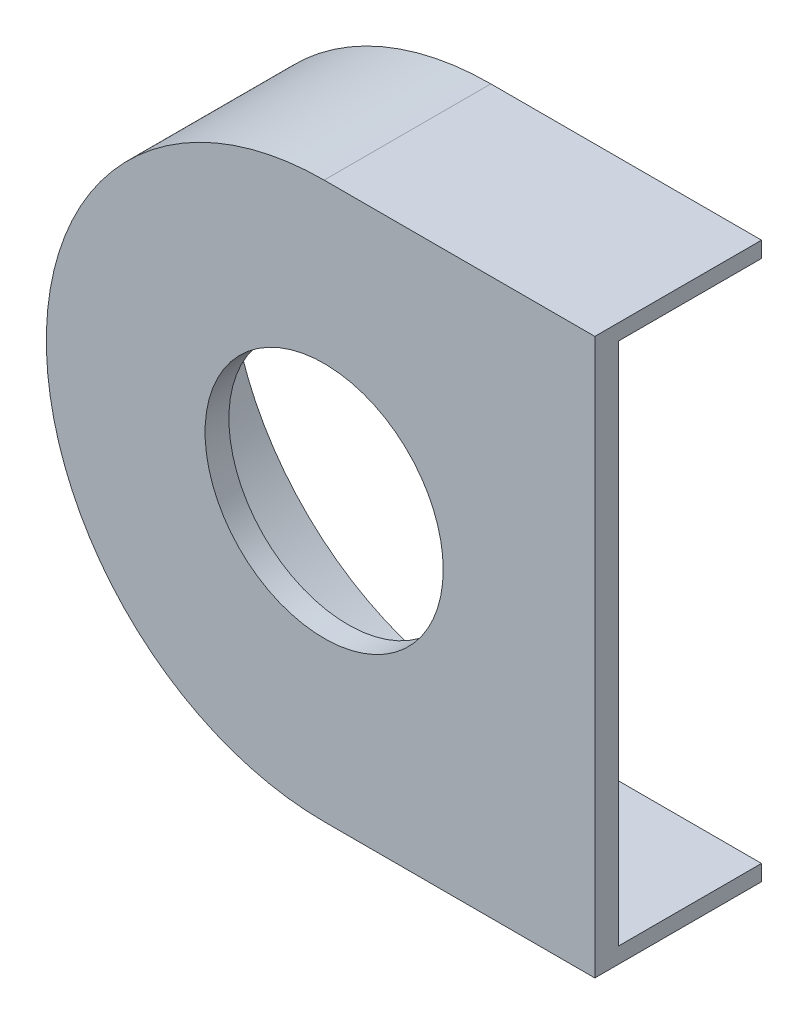
ISO-10303-21;
HEADER;
FILE_DESCRIPTION(('STEP AP214'),'2;1');
FILE_NAME('part.step','',(''),(''),'','','');
FILE_SCHEMA(('AUTOMOTIVE_DESIGN { 1 0 10303 214 1 1 1 1 }'));
ENDSEC;
DATA;
#1=APPLICATION_CONTEXT('core data for automotive mechanical design processes');
#2=APPLICATION_PROTOCOL_DEFINITION('international standard','automotive_design',2000,#1);
#3=PRODUCT_CONTEXT('',#1,'mechanical');
#4=PRODUCT('Part','Part','',(#3));
#5=PRODUCT_RELATED_PRODUCT_CATEGORY('part','',(#4));
#6=PRODUCT_DEFINITION_FORMATION('','',#4);
#7=PRODUCT_DEFINITION_CONTEXT('part definition',#1,'design');
#8=PRODUCT_DEFINITION('design','',#6,#7);
#9=PRODUCT_DEFINITION_SHAPE('','',#8);
#10=(LENGTH_UNIT() NAMED_UNIT(*) SI_UNIT(.MILLI.,.METRE.));
#11=(NAMED_UNIT(*) PLANE_ANGLE_UNIT() SI_UNIT($,.RADIAN.));
#12=(NAMED_UNIT(*) SI_UNIT($,.STERADIAN.) SOLID_ANGLE_UNIT());
#13=UNCERTAINTY_MEASURE_WITH_UNIT(LENGTH_MEASURE(1.E-05),#10,'distance_accuracy_value','');
#14=(GEOMETRIC_REPRESENTATION_CONTEXT(3) GLOBAL_UNCERTAINTY_ASSIGNED_CONTEXT((#13)) GLOBAL_UNIT_ASSIGNED_CONTEXT((#10,
#11,#12)) REPRESENTATION_CONTEXT('',''));
#15=CARTESIAN_POINT('',(0.,0.,0.));
#16=DIRECTION('',(0.,0.,1.));
#17=DIRECTION('',(1.,0.,0.));
#18=AXIS2_PLACEMENT_3D('',#15,#16,#17);
#19=CARTESIAN_POINT('',(0.,0.,0.));
#20=DIRECTION('',(0.,0.,1.));
#21=DIRECTION('',(1.,0.,0.));
#22=AXIS2_PLACEMENT_3D('',#19,#20,#21);
#23=PLANE('',#22);
#24=CARTESIAN_POINT('',(0.,0.,0.));
#25=DIRECTION('',(0.,0.,1.));
#26=DIRECTION('',(1.,0.,0.));
#27=AXIS2_PLACEMENT_3D('',#24,#25,#26);
#28=CIRCLE('',#27,7.5);
#29=CARTESIAN_POINT('',(7.5,0.,0.));
#30=VERTEX_POINT('',#29);
#31=EDGE_CURVE('E130',#30,#30,#28,.T.);
#32=ORIENTED_EDGE('',*,*,#31,.T.);
#33=EDGE_LOOP('',(#32));
#34=FACE_BOUND('',#33,.T.);
#35=DIRECTION('',(1.,0.,0.));
#36=VECTOR('',#35,1.);
#37=CARTESIAN_POINT('',(0.,-16.5,0.));
#38=LINE('',#37,#36);
#39=CARTESIAN_POINT('',(0.,-16.5,0.));
#40=VERTEX_POINT('',#39);
#41=CARTESIAN_POINT('',(17.05,-16.5,0.));
#42=VERTEX_POINT('',#41);
#43=EDGE_CURVE('E55',#40,#42,#38,.T.);
#44=ORIENTED_EDGE('',*,*,#43,.F.);
#45=CARTESIAN_POINT('',(0.,0.,0.));
#46=DIRECTION('',(0.,0.,1.));
#47=DIRECTION('',(-1.,0.,0.));
#48=AXIS2_PLACEMENT_3D('',#45,#46,#47);
#49=CIRCLE('',#48,16.5);
#50=CARTESIAN_POINT('',(0.,16.5,0.));
#51=VERTEX_POINT('',#50);
#52=EDGE_CURVE('E194',#51,#40,#49,.T.);
#53=ORIENTED_EDGE('',*,*,#52,.F.);
#54=DIRECTION('',(-1.,0.,0.));
#55=VECTOR('',#54,1.);
#56=CARTESIAN_POINT('',(17.05,16.5,0.));
#57=LINE('',#56,#55);
#58=CARTESIAN_POINT('',(17.05,16.5,0.));
#59=VERTEX_POINT('',#58);
#60=EDGE_CURVE('E60',#59,#51,#57,.T.);
#61=ORIENTED_EDGE('',*,*,#60,.F.);
#62=DIRECTION('',(0.,1.,0.));
#63=VECTOR('',#62,1.);
#64=CARTESIAN_POINT('',(17.05,-17.5,0.));
#65=LINE('',#64,#63);
#66=EDGE_CURVE('E128',#42,#59,#65,.T.);
#67=ORIENTED_EDGE('',*,*,#66,.F.);
#68=EDGE_LOOP('',(#44,#53,#61,#67));
#69=FACE_BOUND('',#68,.T.);
#70=ADVANCED_FACE('F39',(#34,#69),#23,.F.);
#71=CARTESIAN_POINT('',(0.,0.,1.5));
#72=DIRECTION('',(0.,0.,1.));
#73=DIRECTION('',(1.,0.,0.));
#74=AXIS2_PLACEMENT_3D('',#71,#72,#73);
#75=PLANE('',#74);
#76=CARTESIAN_POINT('',(0.,0.,1.5));
#77=DIRECTION('',(0.,0.,1.));
#78=DIRECTION('',(1.,0.,0.));
#79=AXIS2_PLACEMENT_3D('',#76,#77,#78);
#80=CIRCLE('',#79,17.5);
#81=CARTESIAN_POINT('',(0.,17.5,1.5));
#82=VERTEX_POINT('',#81);
#83=CARTESIAN_POINT('',(0.,-17.5,1.5));
#84=VERTEX_POINT('',#83);
#85=EDGE_CURVE('E144',#82,#84,#80,.T.);
#86=ORIENTED_EDGE('',*,*,#85,.T.);
#87=DIRECTION('',(1.,0.,0.));
#88=VECTOR('',#87,1.);
#89=CARTESIAN_POINT('',(17.05,-17.5,1.5));
#90=LINE('',#89,#88);
#91=CARTESIAN_POINT('',(17.05,-17.5,1.5));
#92=VERTEX_POINT('',#91);
#93=EDGE_CURVE('E148',#84,#92,#90,.T.);
#94=ORIENTED_EDGE('',*,*,#93,.T.);
#95=DIRECTION('',(0.,1.,0.));
#96=VECTOR('',#95,1.);
#97=CARTESIAN_POINT('',(17.05,-17.5,1.5));
#98=LINE('',#97,#96);
#99=CARTESIAN_POINT('',(17.05,17.5,1.5));
#100=VERTEX_POINT('',#99);
#101=EDGE_CURVE('E151',#92,#100,#98,.T.);
#102=ORIENTED_EDGE('',*,*,#101,.T.);
#103=DIRECTION('',(-1.,0.,0.));
#104=VECTOR('',#103,1.);
#105=CARTESIAN_POINT('',(17.05,17.5,1.5));
#106=LINE('',#105,#104);
#107=EDGE_CURVE('E154',#100,#82,#106,.T.);
#108=ORIENTED_EDGE('',*,*,#107,.T.);
#109=EDGE_LOOP('',(#86,#94,#102,#108));
#110=FACE_BOUND('',#109,.T.);
#111=CARTESIAN_POINT('',(0.,0.,1.5));
#112=DIRECTION('',(0.,0.,1.));
#113=DIRECTION('',(1.,0.,0.));
#114=AXIS2_PLACEMENT_3D('',#111,#112,#113);
#115=CIRCLE('',#114,7.5);
#116=CARTESIAN_POINT('',(7.5,0.,1.5));
#117=VERTEX_POINT('',#116);
#118=EDGE_CURVE('E135',#117,#117,#115,.T.);
#119=ORIENTED_EDGE('',*,*,#118,.F.);
#120=EDGE_LOOP('',(#119));
#121=FACE_BOUND('',#120,.T.);
#122=ADVANCED_FACE('F208',(#110,#121),#75,.T.);
#123=CARTESIAN_POINT('',(0.,0.,1.5));
#124=DIRECTION('',(0.,0.,-1.));
#125=DIRECTION('',(-1.,0.,0.));
#126=AXIS2_PLACEMENT_3D('',#123,#124,#125);
#127=CYLINDRICAL_SURFACE('',#126,17.5);
#128=DIRECTION('',(0.,0.,-1.));
#129=VECTOR('',#128,1.);
#130=CARTESIAN_POINT('',(0.,17.5,1.5));
#131=LINE('',#130,#129);
#132=CARTESIAN_POINT('',(0.,17.5,-9.));
#133=VERTEX_POINT('',#132);
#134=EDGE_CURVE('E157',#82,#133,#131,.T.);
#135=ORIENTED_EDGE('',*,*,#134,.T.);
#136=CARTESIAN_POINT('',(0.,0.,-9.));
#137=DIRECTION('',(0.,0.,-1.));
#138=DIRECTION('',(-1.,0.,0.));
#139=AXIS2_PLACEMENT_3D('',#136,#137,#138);
#140=CIRCLE('',#139,17.5);
#141=CARTESIAN_POINT('',(0.,-17.5,-9.));
#142=VERTEX_POINT('',#141);
#143=EDGE_CURVE('E183',#142,#133,#140,.T.);
#144=ORIENTED_EDGE('',*,*,#143,.F.);
#145=DIRECTION('',(0.,0.,-1.));
#146=VECTOR('',#145,1.);
#147=CARTESIAN_POINT('',(0.,-17.5,1.5));
#148=LINE('',#147,#146);
#149=EDGE_CURVE('E11',#84,#142,#148,.T.);
#150=ORIENTED_EDGE('',*,*,#149,.F.);
#151=ORIENTED_EDGE('',*,*,#85,.F.);
#152=EDGE_LOOP('',(#135,#144,#150,#151));
#153=FACE_BOUND('',#152,.T.);
#154=ADVANCED_FACE('F41',(#153),#127,.T.);
#155=CARTESIAN_POINT('',(17.05,-17.5,1.5));
#156=DIRECTION('',(0.,1.,0.));
#157=DIRECTION('',(-1.,0.,0.));
#158=AXIS2_PLACEMENT_3D('',#155,#156,#157);
#159=PLANE('',#158);
#160=ORIENTED_EDGE('',*,*,#149,.T.);
#161=DIRECTION('',(-1.,0.,0.));
#162=VECTOR('',#161,1.);
#163=CARTESIAN_POINT('',(0.,-17.5,-9.));
#164=LINE('',#163,#162);
#165=CARTESIAN_POINT('',(17.05,-17.5,-9.));
#166=VERTEX_POINT('',#165);
#167=EDGE_CURVE('E173',#166,#142,#164,.T.);
#168=ORIENTED_EDGE('',*,*,#167,.F.);
#169=DIRECTION('',(0.,0.,-1.));
#170=VECTOR('',#169,1.);
#171=CARTESIAN_POINT('',(17.05,-17.5,1.5));
#172=LINE('',#171,#170);
#173=EDGE_CURVE('E48',#92,#166,#172,.T.);
#174=ORIENTED_EDGE('',*,*,#173,.F.);
#175=ORIENTED_EDGE('',*,*,#93,.F.);
#176=EDGE_LOOP('',(#160,#168,#174,#175));
#177=FACE_BOUND('',#176,.T.);
#178=ADVANCED_FACE('F180',(#177),#159,.F.);
#179=CARTESIAN_POINT('',(17.05,-17.5,1.5));
#180=DIRECTION('',(-1.,0.,0.));
#181=DIRECTION('',(0.,0.,1.));
#182=AXIS2_PLACEMENT_3D('',#179,#180,#181);
#183=PLANE('',#182);
#184=ORIENTED_EDGE('',*,*,#173,.T.);
#185=DIRECTION('',(0.,-1.,0.));
#186=VECTOR('',#185,1.);
#187=CARTESIAN_POINT('',(17.05,-16.5,-9.));
#188=LINE('',#187,#186);
#189=CARTESIAN_POINT('',(17.05,-16.5,-9.));
#190=VERTEX_POINT('',#189);
#191=EDGE_CURVE('E169',#190,#166,#188,.T.);
#192=ORIENTED_EDGE('',*,*,#191,.F.);
#193=DIRECTION('',(0.,0.,1.));
#194=VECTOR('',#193,1.);
#195=CARTESIAN_POINT('',(17.05,-16.5,-9.));
#196=LINE('',#195,#194);
#197=EDGE_CURVE('E191',#190,#42,#196,.T.);
#198=ORIENTED_EDGE('',*,*,#197,.T.);
#199=ORIENTED_EDGE('',*,*,#66,.T.);
#200=DIRECTION('',(0.,0.,1.));
#201=VECTOR('',#200,1.);
#202=CARTESIAN_POINT('',(17.05,16.5,-9.));
#203=LINE('',#202,#201);
#204=CARTESIAN_POINT('',(17.05,16.5,-9.));
#205=VERTEX_POINT('',#204);
#206=EDGE_CURVE('E107',#205,#59,#203,.T.);
#207=ORIENTED_EDGE('',*,*,#206,.F.);
#208=DIRECTION('',(0.,-1.,0.));
#209=VECTOR('',#208,1.);
#210=CARTESIAN_POINT('',(17.05,17.5,-9.));
#211=LINE('',#210,#209);
#212=CARTESIAN_POINT('',(17.05,17.5,-9.));
#213=VERTEX_POINT('',#212);
#214=EDGE_CURVE('E114',#213,#205,#211,.T.);
#215=ORIENTED_EDGE('',*,*,#214,.F.);
#216=DIRECTION('',(0.,0.,-1.));
#217=VECTOR('',#216,1.);
#218=CARTESIAN_POINT('',(17.05,17.5,1.5));
#219=LINE('',#218,#217);
#220=EDGE_CURVE('E162',#100,#213,#219,.T.);
#221=ORIENTED_EDGE('',*,*,#220,.F.);
#222=ORIENTED_EDGE('',*,*,#101,.F.);
#223=EDGE_LOOP('',(#184,#192,#198,#199,#207,#215,#221,#222));
#224=FACE_BOUND('',#223,.T.);
#225=ADVANCED_FACE('F126',(#224),#183,.F.);
#226=CARTESIAN_POINT('',(17.05,17.5,1.5));
#227=DIRECTION('',(0.,-1.,0.));
#228=DIRECTION('',(1.,0.,0.));
#229=AXIS2_PLACEMENT_3D('',#226,#227,#228);
#230=PLANE('',#229);
#231=ORIENTED_EDGE('',*,*,#220,.T.);
#232=DIRECTION('',(1.,0.,0.));
#233=VECTOR('',#232,1.);
#234=CARTESIAN_POINT('',(17.05,17.5,-9.));
#235=LINE('',#234,#233);
#236=EDGE_CURVE('E121',#133,#213,#235,.T.);
#237=ORIENTED_EDGE('',*,*,#236,.F.);
#238=ORIENTED_EDGE('',*,*,#134,.F.);
#239=ORIENTED_EDGE('',*,*,#107,.F.);
#240=EDGE_LOOP('',(#231,#237,#238,#239));
#241=FACE_BOUND('',#240,.T.);
#242=ADVANCED_FACE('F218',(#241),#230,.F.);
#243=CARTESIAN_POINT('',(0.,0.,1.5));
#244=DIRECTION('',(0.,0.,-1.));
#245=DIRECTION('',(-1.,0.,0.));
#246=AXIS2_PLACEMENT_3D('',#243,#244,#245);
#247=CYLINDRICAL_SURFACE('',#246,7.5);
#248=ORIENTED_EDGE('',*,*,#118,.T.);
#249=EDGE_LOOP('',(#248));
#250=FACE_BOUND('',#249,.T.);
#251=ORIENTED_EDGE('',*,*,#31,.F.);
#252=EDGE_LOOP('',(#251));
#253=FACE_BOUND('',#252,.T.);
#254=ADVANCED_FACE('F221',(#250,#253),#247,.F.);
#255=CARTESIAN_POINT('',(17.05,16.5,-9.));
#256=DIRECTION('',(0.,1.,0.));
#257=DIRECTION('',(0.,0.,1.));
#258=AXIS2_PLACEMENT_3D('',#255,#256,#257);
#259=PLANE('',#258);
#260=ORIENTED_EDGE('',*,*,#60,.T.);
#261=DIRECTION('',(0.,0.,1.));
#262=VECTOR('',#261,1.);
#263=CARTESIAN_POINT('',(0.,16.5,-9.));
#264=LINE('',#263,#262);
#265=CARTESIAN_POINT('',(0.,16.5,-9.));
#266=VERTEX_POINT('',#265);
#267=EDGE_CURVE('E109',#266,#51,#264,.T.);
#268=ORIENTED_EDGE('',*,*,#267,.F.);
#269=DIRECTION('',(-1.,0.,0.));
#270=VECTOR('',#269,1.);
#271=CARTESIAN_POINT('',(17.05,16.5,-9.));
#272=LINE('',#271,#270);
#273=EDGE_CURVE('E103',#205,#266,#272,.T.);
#274=ORIENTED_EDGE('',*,*,#273,.F.);
#275=ORIENTED_EDGE('',*,*,#206,.T.);
#276=EDGE_LOOP('',(#260,#268,#274,#275));
#277=FACE_BOUND('',#276,.T.);
#278=ADVANCED_FACE('F105',(#277),#259,.F.);
#279=CARTESIAN_POINT('',(0.,0.,-9.));
#280=DIRECTION('',(0.,0.,1.));
#281=DIRECTION('',(1.,0.,0.));
#282=AXIS2_PLACEMENT_3D('',#279,#280,#281);
#283=CYLINDRICAL_SURFACE('',#282,16.5);
#284=ORIENTED_EDGE('',*,*,#52,.T.);
#285=DIRECTION('',(0.,0.,1.));
#286=VECTOR('',#285,1.);
#287=CARTESIAN_POINT('',(0.,-16.5,-9.));
#288=LINE('',#287,#286);
#289=CARTESIAN_POINT('',(0.,-16.5,-9.));
#290=VERTEX_POINT('',#289);
#291=EDGE_CURVE('E137',#290,#40,#288,.T.);
#292=ORIENTED_EDGE('',*,*,#291,.F.);
#293=CARTESIAN_POINT('',(0.,0.,-9.));
#294=DIRECTION('',(0.,0.,1.));
#295=DIRECTION('',(-1.,0.,0.));
#296=AXIS2_PLACEMENT_3D('',#293,#294,#295);
#297=CIRCLE('',#296,16.5);
#298=EDGE_CURVE('E113',#266,#290,#297,.T.);
#299=ORIENTED_EDGE('',*,*,#298,.F.);
#300=ORIENTED_EDGE('',*,*,#267,.T.);
#301=EDGE_LOOP('',(#284,#292,#299,#300));
#302=FACE_BOUND('',#301,.T.);
#303=ADVANCED_FACE('F206',(#302),#283,.F.);
#304=CARTESIAN_POINT('',(0.,-16.5,-9.));
#305=DIRECTION('',(0.,-1.,0.));
#306=DIRECTION('',(1.,0.,0.));
#307=AXIS2_PLACEMENT_3D('',#304,#305,#306);
#308=PLANE('',#307);
#309=ORIENTED_EDGE('',*,*,#43,.T.);
#310=ORIENTED_EDGE('',*,*,#197,.F.);
#311=DIRECTION('',(1.,0.,0.));
#312=VECTOR('',#311,1.);
#313=CARTESIAN_POINT('',(0.,-16.5,-9.));
#314=LINE('',#313,#312);
#315=EDGE_CURVE('E176',#290,#190,#314,.T.);
#316=ORIENTED_EDGE('',*,*,#315,.F.);
#317=ORIENTED_EDGE('',*,*,#291,.T.);
#318=EDGE_LOOP('',(#309,#310,#316,#317));
#319=FACE_BOUND('',#318,.T.);
#320=ADVANCED_FACE('F204',(#319),#308,.F.);
#321=CARTESIAN_POINT('',(0.,0.,-9.));
#322=DIRECTION('',(0.,0.,-1.));
#323=DIRECTION('',(-1.,0.,0.));
#324=AXIS2_PLACEMENT_3D('',#321,#322,#323);
#325=PLANE('',#324);
#326=ORIENTED_EDGE('',*,*,#214,.T.);
#327=ORIENTED_EDGE('',*,*,#273,.T.);
#328=ORIENTED_EDGE('',*,*,#298,.T.);
#329=ORIENTED_EDGE('',*,*,#315,.T.);
#330=ORIENTED_EDGE('',*,*,#191,.T.);
#331=ORIENTED_EDGE('',*,*,#167,.T.);
#332=ORIENTED_EDGE('',*,*,#143,.T.);
#333=ORIENTED_EDGE('',*,*,#236,.T.);
#334=EDGE_LOOP('',(#326,#327,#328,#329,#330,#331,#332,#333));
#335=FACE_BOUND('',#334,.T.);
#336=ADVANCED_FACE('F118',(#335),#325,.T.);
#337=CLOSED_SHELL('',(#70,#122,#154,#178,#225,#242,#254,#278,#303,#320,#336));
#338=MANIFOLD_SOLID_BREP('B2',#337);
#339=ADVANCED_BREP_SHAPE_REPRESENTATION('',(#18,#338),#14);
#340=SHAPE_DEFINITION_REPRESENTATION(#9,#339);
ENDSEC;
END-ISO-10303-21;
